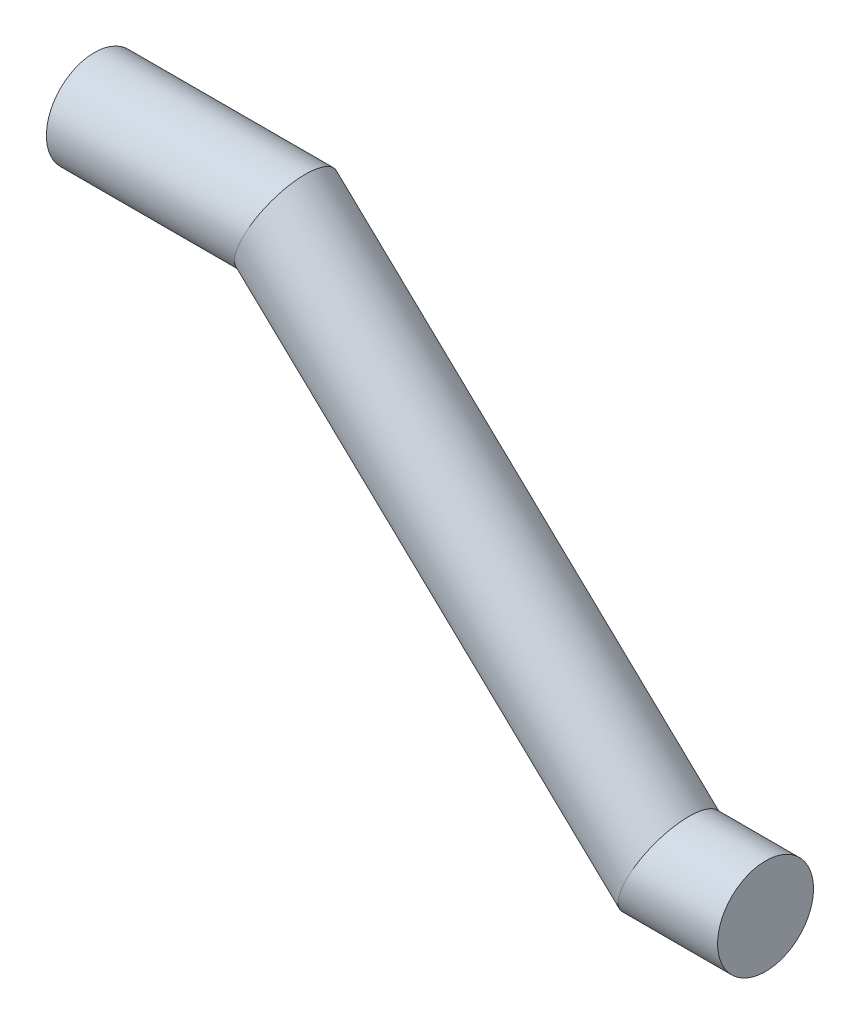
ISO-10303-21;
HEADER;
FILE_DESCRIPTION(('STEP AP214'),'2;1');
FILE_NAME('part.step','',(''),(''),'','','');
FILE_SCHEMA(('AUTOMOTIVE_DESIGN { 1 0 10303 214 1 1 1 1 }'));
ENDSEC;
DATA;
#1=APPLICATION_CONTEXT('core data for automotive mechanical design processes');
#2=APPLICATION_PROTOCOL_DEFINITION('international standard','automotive_design',2000,#1);
#3=PRODUCT_CONTEXT('',#1,'mechanical');
#4=PRODUCT('Part','Part','',(#3));
#5=PRODUCT_RELATED_PRODUCT_CATEGORY('part','',(#4));
#6=PRODUCT_DEFINITION_FORMATION('','',#4);
#7=PRODUCT_DEFINITION_CONTEXT('part definition',#1,'design');
#8=PRODUCT_DEFINITION('design','',#6,#7);
#9=PRODUCT_DEFINITION_SHAPE('','',#8);
#10=(LENGTH_UNIT() NAMED_UNIT(*) SI_UNIT(.MILLI.,.METRE.));
#11=(NAMED_UNIT(*) PLANE_ANGLE_UNIT() SI_UNIT($,.RADIAN.));
#12=(NAMED_UNIT(*) SI_UNIT($,.STERADIAN.) SOLID_ANGLE_UNIT());
#13=UNCERTAINTY_MEASURE_WITH_UNIT(LENGTH_MEASURE(1.E-05),#10,'distance_accuracy_value','');
#14=(GEOMETRIC_REPRESENTATION_CONTEXT(3) GLOBAL_UNCERTAINTY_ASSIGNED_CONTEXT((#13)) GLOBAL_UNIT_ASSIGNED_CONTEXT((#10,
#11,#12)) REPRESENTATION_CONTEXT('',''));
#15=CARTESIAN_POINT('',(0.,0.,0.));
#16=DIRECTION('',(0.,0.,1.));
#17=DIRECTION('',(1.,0.,0.));
#18=AXIS2_PLACEMENT_3D('',#15,#16,#17);
#19=CARTESIAN_POINT('',(350.,-190.,0.));
#20=DIRECTION('',(1.,0.,0.));
#21=DIRECTION('',(0.,0.,-1.));
#22=AXIS2_PLACEMENT_3D('',#19,#20,#21);
#23=PLANE('',#22);
#24=CARTESIAN_POINT('',(350.,-190.,0.));
#25=DIRECTION('',(1.,0.,0.));
#26=DIRECTION('',(0.,0.,-1.));
#27=AXIS2_PLACEMENT_3D('',#24,#25,#26);
#28=CIRCLE('',#27,25.);
#29=CARTESIAN_POINT('',(350.,-190.,-25.));
#30=VERTEX_POINT('',#29);
#31=EDGE_CURVE('E34',#30,#30,#28,.T.);
#32=ORIENTED_EDGE('',*,*,#31,.T.);
#33=EDGE_LOOP('',(#32));
#34=FACE_BOUND('',#33,.T.);
#35=ADVANCED_FACE('F31',(#34),#23,.T.);
#36=CARTESIAN_POINT('',(0.,0.,0.));
#37=DIRECTION('',(1.,0.,0.));
#38=DIRECTION('',(0.,0.,-1.));
#39=AXIS2_PLACEMENT_3D('',#36,#37,#38);
#40=PLANE('',#39);
#41=CARTESIAN_POINT('',(0.,0.,0.));
#42=DIRECTION('',(1.,0.,0.));
#43=DIRECTION('',(0.,0.,-1.));
#44=AXIS2_PLACEMENT_3D('',#41,#42,#43);
#45=CIRCLE('',#44,25.);
#46=CARTESIAN_POINT('',(0.,0.,-25.));
#47=VERTEX_POINT('',#46);
#48=EDGE_CURVE('E38',#47,#47,#45,.T.);
#49=ORIENTED_EDGE('',*,*,#48,.F.);
#50=EDGE_LOOP('',(#49));
#51=FACE_BOUND('',#50,.T.);
#52=ADVANCED_FACE('F55',(#51),#40,.F.);
#53=CARTESIAN_POINT('',(277.939865018173,-190.,0.));
#54=DIRECTION('',(1.,0.,0.));
#55=DIRECTION('',(0.,0.,-1.));
#56=AXIS2_PLACEMENT_3D('',#53,#54,#55);
#57=CYLINDRICAL_SURFACE('',#56,25.);
#58=CARTESIAN_POINT('',(300.,-190.,0.));
#59=DIRECTION('',(0.928708628579065,-0.370810306225155,0.));
#60=DIRECTION('',(-0.370810306225155,-0.928708628579065,0.));
#61=AXIS2_PLACEMENT_3D('',#58,#59,#60);
#62=ELLIPSE('',#61,26.9190995223661,25.);
#63=CARTESIAN_POINT('',(290.018120462806,-215.,0.));
#64=VERTEX_POINT('',#63);
#65=EDGE_CURVE('E43',#64,#64,#62,.F.);
#66=ORIENTED_EDGE('',*,*,#65,.F.);
#67=EDGE_LOOP('',(#66));
#68=FACE_BOUND('',#67,.T.);
#69=ORIENTED_EDGE('',*,*,#31,.F.);
#70=EDGE_LOOP('',(#69));
#71=FACE_BOUND('',#70,.T.);
#72=ADVANCED_FACE('F52',(#68,#71),#57,.T.);
#73=CARTESIAN_POINT('',(84.0064146331593,15.1939060984987,0.));
#74=DIRECTION('',(0.724999433594414,-0.688749461914693,0.));
#75=DIRECTION('',(0.688749461914693,0.724999433594414,0.));
#76=AXIS2_PLACEMENT_3D('',#73,#74,#75);
#77=CYLINDRICAL_SURFACE('',#76,25.);
#78=CARTESIAN_POINT('',(100.,0.,0.));
#79=DIRECTION('',(0.928708628579065,-0.370810306225155,0.));
#80=DIRECTION('',(0.370810306225155,0.928708628579065,0.));
#81=AXIS2_PLACEMENT_3D('',#78,#79,#80);
#82=ELLIPSE('',#81,26.9190995223661,25.);
#83=CARTESIAN_POINT('',(109.981879537194,25.,0.));
#84=VERTEX_POINT('',#83);
#85=EDGE_CURVE('E10',#84,#84,#82,.F.);
#86=ORIENTED_EDGE('',*,*,#85,.F.);
#87=EDGE_LOOP('',(#86));
#88=FACE_BOUND('',#87,.T.);
#89=ORIENTED_EDGE('',*,*,#65,.T.);
#90=EDGE_LOOP('',(#89));
#91=FACE_BOUND('',#90,.T.);
#92=ADVANCED_FACE('F54',(#88,#91),#77,.T.);
#93=CARTESIAN_POINT('',(0.,0.,0.));
#94=DIRECTION('',(1.,0.,0.));
#95=DIRECTION('',(0.,0.,-1.));
#96=AXIS2_PLACEMENT_3D('',#93,#94,#95);
#97=CYLINDRICAL_SURFACE('',#96,25.);
#98=ORIENTED_EDGE('',*,*,#48,.T.);
#99=EDGE_LOOP('',(#98));
#100=FACE_BOUND('',#99,.T.);
#101=ORIENTED_EDGE('',*,*,#85,.T.);
#102=EDGE_LOOP('',(#101));
#103=FACE_BOUND('',#102,.T.);
#104=ADVANCED_FACE('F62',(#100,#103),#97,.T.);
#105=CLOSED_SHELL('',(#35,#52,#72,#92,#104));
#106=MANIFOLD_SOLID_BREP('B2',#105);
#107=ADVANCED_BREP_SHAPE_REPRESENTATION('',(#18,#106),#14);
#108=SHAPE_DEFINITION_REPRESENTATION(#9,#107);
ENDSEC;
END-ISO-10303-21;
